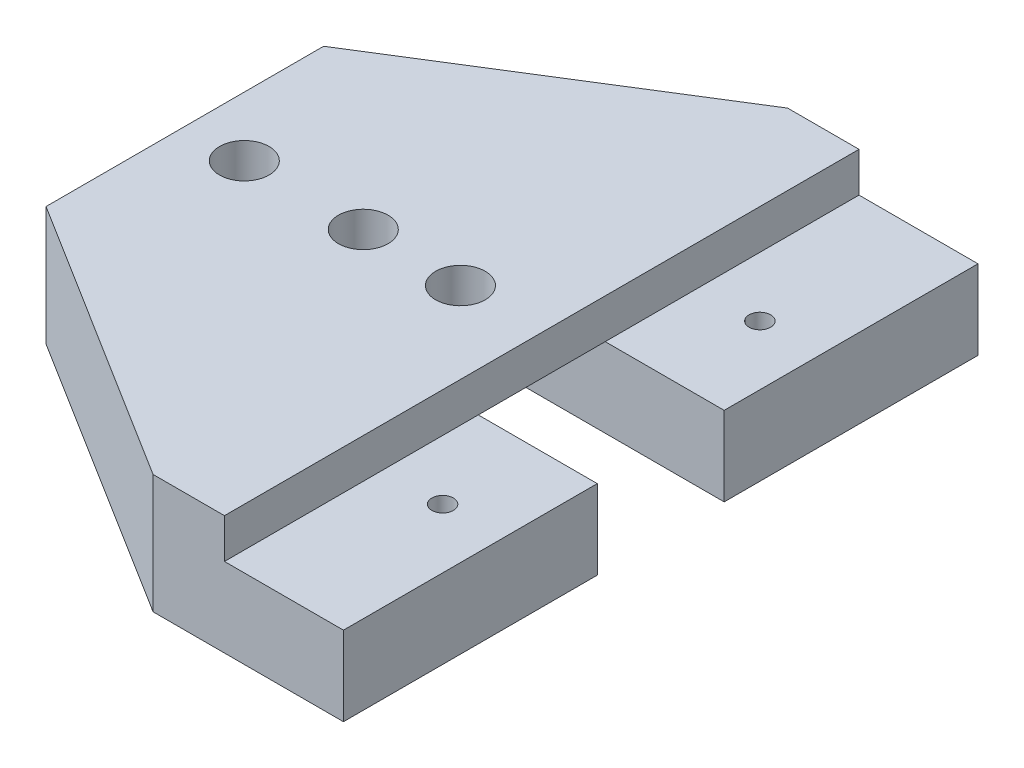
ISO-10303-21;
HEADER;
FILE_DESCRIPTION(('STEP AP214'),'2;1');
FILE_NAME('part.step','',(''),(''),'','','');
FILE_SCHEMA(('AUTOMOTIVE_DESIGN { 1 0 10303 214 1 1 1 1 }'));
ENDSEC;
DATA;
#1=APPLICATION_CONTEXT('core data for automotive mechanical design processes');
#2=APPLICATION_PROTOCOL_DEFINITION('international standard','automotive_design',2000,#1);
#3=PRODUCT_CONTEXT('',#1,'mechanical');
#4=PRODUCT('Part','Part','',(#3));
#5=PRODUCT_RELATED_PRODUCT_CATEGORY('part','',(#4));
#6=PRODUCT_DEFINITION_FORMATION('','',#4);
#7=PRODUCT_DEFINITION_CONTEXT('part definition',#1,'design');
#8=PRODUCT_DEFINITION('design','',#6,#7);
#9=PRODUCT_DEFINITION_SHAPE('','',#8);
#10=(LENGTH_UNIT() NAMED_UNIT(*) SI_UNIT(.MILLI.,.METRE.));
#11=(NAMED_UNIT(*) PLANE_ANGLE_UNIT() SI_UNIT($,.RADIAN.));
#12=(NAMED_UNIT(*) SI_UNIT($,.STERADIAN.) SOLID_ANGLE_UNIT());
#13=UNCERTAINTY_MEASURE_WITH_UNIT(LENGTH_MEASURE(1.E-05),#10,'distance_accuracy_value','');
#14=(GEOMETRIC_REPRESENTATION_CONTEXT(3) GLOBAL_UNCERTAINTY_ASSIGNED_CONTEXT((#13)) GLOBAL_UNIT_ASSIGNED_CONTEXT((#10,
#11,#12)) REPRESENTATION_CONTEXT('',''));
#15=CARTESIAN_POINT('',(0.,0.,0.));
#16=DIRECTION('',(0.,0.,1.));
#17=DIRECTION('',(1.,0.,0.));
#18=AXIS2_PLACEMENT_3D('',#15,#16,#17);
#19=CARTESIAN_POINT('',(-15.24,9.525,50.8));
#20=DIRECTION('',(0.,0.,-1.));
#21=DIRECTION('',(-1.,0.,0.));
#22=AXIS2_PLACEMENT_3D('',#19,#20,#21);
#23=PLANE('',#22);
#24=DIRECTION('',(0.,1.,0.));
#25=VECTOR('',#24,1.);
#26=CARTESIAN_POINT('',(-3.81,3.175,50.8));
#27=LINE('',#26,#25);
#28=CARTESIAN_POINT('',(-3.81,3.175,50.8));
#29=VERTEX_POINT('',#28);
#30=CARTESIAN_POINT('',(-3.81,9.525,50.8));
#31=VERTEX_POINT('',#30);
#32=EDGE_CURVE('E150',#29,#31,#27,.T.);
#33=ORIENTED_EDGE('',*,*,#32,.T.);
#34=DIRECTION('',(1.,0.,0.));
#35=VECTOR('',#34,1.);
#36=CARTESIAN_POINT('',(-15.24,9.525,50.8));
#37=LINE('',#36,#35);
#38=CARTESIAN_POINT('',(-15.24,9.525,50.8));
#39=VERTEX_POINT('',#38);
#40=EDGE_CURVE('E213',#39,#31,#37,.T.);
#41=ORIENTED_EDGE('',*,*,#40,.F.);
#42=DIRECTION('',(0.,-1.,0.));
#43=VECTOR('',#42,1.);
#44=CARTESIAN_POINT('',(-15.24,9.525,50.8));
#45=LINE('',#44,#43);
#46=CARTESIAN_POINT('',(-15.24,-9.525,50.8));
#47=VERTEX_POINT('',#46);
#48=EDGE_CURVE('E229',#39,#47,#45,.T.);
#49=ORIENTED_EDGE('',*,*,#48,.T.);
#50=DIRECTION('',(1.,0.,0.));
#51=VECTOR('',#50,1.);
#52=CARTESIAN_POINT('',(-15.24,-9.525,50.8));
#53=LINE('',#52,#51);
#54=CARTESIAN_POINT('',(15.24,-9.525,50.8));
#55=VERTEX_POINT('',#54);
#56=EDGE_CURVE('E203',#47,#55,#53,.T.);
#57=ORIENTED_EDGE('',*,*,#56,.T.);
#58=DIRECTION('',(0.,-1.,0.));
#59=VECTOR('',#58,1.);
#60=CARTESIAN_POINT('',(15.24,9.525,50.8));
#61=LINE('',#60,#59);
#62=CARTESIAN_POINT('',(15.24,3.175,50.8));
#63=VERTEX_POINT('',#62);
#64=EDGE_CURVE('E52',#63,#55,#61,.T.);
#65=ORIENTED_EDGE('',*,*,#64,.F.);
#66=DIRECTION('',(-1.,0.,0.));
#67=VECTOR('',#66,1.);
#68=CARTESIAN_POINT('',(15.24,3.175,50.8));
#69=LINE('',#68,#67);
#70=EDGE_CURVE('E140',#63,#29,#69,.T.);
#71=ORIENTED_EDGE('',*,*,#70,.T.);
#72=EDGE_LOOP('',(#33,#41,#49,#57,#65,#71));
#73=FACE_BOUND('',#72,.T.);
#74=ADVANCED_FACE('F43',(#73),#23,.F.);
#75=CARTESIAN_POINT('',(15.24,9.525,50.8));
#76=DIRECTION('',(-1.,0.,0.));
#77=DIRECTION('',(0.,0.,1.));
#78=AXIS2_PLACEMENT_3D('',#75,#76,#77);
#79=PLANE('',#78);
#80=DIRECTION('',(0.,-1.,0.));
#81=VECTOR('',#80,1.);
#82=CARTESIAN_POINT('',(15.24,9.525,-50.8));
#83=LINE('',#82,#81);
#84=CARTESIAN_POINT('',(15.24,3.175,-50.8));
#85=VERTEX_POINT('',#84);
#86=CARTESIAN_POINT('',(15.24,-9.525,-50.8));
#87=VERTEX_POINT('',#86);
#88=EDGE_CURVE('E265',#85,#87,#83,.T.);
#89=ORIENTED_EDGE('',*,*,#88,.F.);
#90=DIRECTION('',(0.,0.,-1.));
#91=VECTOR('',#90,1.);
#92=CARTESIAN_POINT('',(15.24,3.175,50.8));
#93=LINE('',#92,#91);
#94=CARTESIAN_POINT('',(15.24,3.175,-10.16));
#95=VERTEX_POINT('',#94);
#96=EDGE_CURVE('E176',#95,#85,#93,.T.);
#97=ORIENTED_EDGE('',*,*,#96,.F.);
#98=DIRECTION('',(0.,-1.,0.));
#99=VECTOR('',#98,1.);
#100=CARTESIAN_POINT('',(15.24,3.175,-10.16));
#101=LINE('',#100,#99);
#102=CARTESIAN_POINT('',(15.24,-9.525,-10.16));
#103=VERTEX_POINT('',#102);
#104=EDGE_CURVE('E207',#95,#103,#101,.T.);
#105=ORIENTED_EDGE('',*,*,#104,.T.);
#106=DIRECTION('',(0.,0.,-1.));
#107=VECTOR('',#106,1.);
#108=CARTESIAN_POINT('',(15.24,-9.525,50.8));
#109=LINE('',#108,#107);
#110=EDGE_CURVE('E232',#103,#87,#109,.T.);
#111=ORIENTED_EDGE('',*,*,#110,.T.);
#112=EDGE_LOOP('',(#89,#97,#105,#111));
#113=FACE_BOUND('',#112,.T.);
#114=ADVANCED_FACE('F322',(#113),#79,.F.);
#115=CARTESIAN_POINT('',(15.24,9.525,-50.8));
#116=DIRECTION('',(0.,0.,1.));
#117=DIRECTION('',(1.,0.,0.));
#118=AXIS2_PLACEMENT_3D('',#115,#116,#117);
#119=PLANE('',#118);
#120=DIRECTION('',(0.,1.,0.));
#121=VECTOR('',#120,1.);
#122=CARTESIAN_POINT('',(-3.81,3.175,-50.8));
#123=LINE('',#122,#121);
#124=CARTESIAN_POINT('',(-3.81,3.175,-50.8));
#125=VERTEX_POINT('',#124);
#126=CARTESIAN_POINT('',(-3.81,9.525,-50.8));
#127=VERTEX_POINT('',#126);
#128=EDGE_CURVE('E159',#125,#127,#123,.T.);
#129=ORIENTED_EDGE('',*,*,#128,.F.);
#130=DIRECTION('',(-1.,0.,0.));
#131=VECTOR('',#130,1.);
#132=CARTESIAN_POINT('',(15.24,3.175,-50.8));
#133=LINE('',#132,#131);
#134=EDGE_CURVE('E146',#85,#125,#133,.T.);
#135=ORIENTED_EDGE('',*,*,#134,.F.);
#136=ORIENTED_EDGE('',*,*,#88,.T.);
#137=DIRECTION('',(-1.,0.,0.));
#138=VECTOR('',#137,1.);
#139=CARTESIAN_POINT('',(15.24,-9.525,-50.8));
#140=LINE('',#139,#138);
#141=CARTESIAN_POINT('',(-15.24,-9.525,-50.8));
#142=VERTEX_POINT('',#141);
#143=EDGE_CURVE('E237',#87,#142,#140,.T.);
#144=ORIENTED_EDGE('',*,*,#143,.T.);
#145=DIRECTION('',(0.,-1.,0.));
#146=VECTOR('',#145,1.);
#147=CARTESIAN_POINT('',(-15.24,9.525,-50.8));
#148=LINE('',#147,#146);
#149=CARTESIAN_POINT('',(-15.24,9.525,-50.8));
#150=VERTEX_POINT('',#149);
#151=EDGE_CURVE('E261',#150,#142,#148,.T.);
#152=ORIENTED_EDGE('',*,*,#151,.F.);
#153=DIRECTION('',(-1.,0.,0.));
#154=VECTOR('',#153,1.);
#155=CARTESIAN_POINT('',(15.24,9.525,-50.8));
#156=LINE('',#155,#154);
#157=EDGE_CURVE('E216',#127,#150,#156,.T.);
#158=ORIENTED_EDGE('',*,*,#157,.F.);
#159=EDGE_LOOP('',(#129,#135,#136,#144,#152,#158));
#160=FACE_BOUND('',#159,.T.);
#161=ADVANCED_FACE('F326',(#160),#119,.F.);
#162=CARTESIAN_POINT('',(0.,9.525,0.));
#163=DIRECTION('',(0.,1.,0.));
#164=DIRECTION('',(0.,0.,1.));
#165=AXIS2_PLACEMENT_3D('',#162,#163,#164);
#166=PLANE('',#165);
#167=CARTESIAN_POINT('',(-51.435,9.525,0.));
#168=DIRECTION('',(0.,1.,0.));
#169=DIRECTION('',(0.,0.,1.));
#170=AXIS2_PLACEMENT_3D('',#167,#168,#169);
#171=CIRCLE('',#170,3.96875);
#172=CARTESIAN_POINT('',(-51.435,9.525,3.96875));
#173=VERTEX_POINT('',#172);
#174=EDGE_CURVE('E287',#173,#173,#171,.T.);
#175=ORIENTED_EDGE('',*,*,#174,.F.);
#176=EDGE_LOOP('',(#175));
#177=FACE_BOUND('',#176,.T.);
#178=CARTESIAN_POINT('',(-32.385,9.525,0.));
#179=DIRECTION('',(0.,1.,0.));
#180=DIRECTION('',(0.,0.,1.));
#181=AXIS2_PLACEMENT_3D('',#178,#179,#180);
#182=CIRCLE('',#181,3.96875);
#183=CARTESIAN_POINT('',(-32.385,9.525,3.96875));
#184=VERTEX_POINT('',#183);
#185=EDGE_CURVE('E275',#184,#184,#182,.T.);
#186=ORIENTED_EDGE('',*,*,#185,.F.);
#187=EDGE_LOOP('',(#186));
#188=FACE_BOUND('',#187,.T.);
#189=CARTESIAN_POINT('',(-16.8275,9.525,0.));
#190=DIRECTION('',(0.,1.,0.));
#191=DIRECTION('',(0.,0.,1.));
#192=AXIS2_PLACEMENT_3D('',#189,#190,#191);
#193=CIRCLE('',#192,3.96875);
#194=CARTESIAN_POINT('',(-16.8275,9.525,3.96875));
#195=VERTEX_POINT('',#194);
#196=EDGE_CURVE('E170',#195,#195,#193,.T.);
#197=ORIENTED_EDGE('',*,*,#196,.F.);
#198=EDGE_LOOP('',(#197));
#199=FACE_BOUND('',#198,.T.);
#200=ORIENTED_EDGE('',*,*,#40,.T.);
#201=DIRECTION('',(0.,0.,-1.));
#202=VECTOR('',#201,1.);
#203=CARTESIAN_POINT('',(-3.81,9.525,50.8));
#204=LINE('',#203,#202);
#205=EDGE_CURVE('E153',#31,#127,#204,.T.);
#206=ORIENTED_EDGE('',*,*,#205,.T.);
#207=ORIENTED_EDGE('',*,*,#157,.T.);
#208=DIRECTION('',(-0.847998304005088,0.,0.52999894000318));
#209=VECTOR('',#208,1.);
#210=CARTESIAN_POINT('',(-15.24,9.525,-50.8));
#211=LINE('',#210,#209);
#212=CARTESIAN_POINT('',(-60.96,9.525,-22.225));
#213=VERTEX_POINT('',#212);
#214=EDGE_CURVE('E220',#150,#213,#211,.T.);
#215=ORIENTED_EDGE('',*,*,#214,.T.);
#216=DIRECTION('',(0.,0.,1.));
#217=VECTOR('',#216,1.);
#218=CARTESIAN_POINT('',(-60.96,9.525,-22.225));
#219=LINE('',#218,#217);
#220=CARTESIAN_POINT('',(-60.96,9.525,22.225));
#221=VERTEX_POINT('',#220);
#222=EDGE_CURVE('E223',#213,#221,#219,.T.);
#223=ORIENTED_EDGE('',*,*,#222,.T.);
#224=DIRECTION('',(0.847998304005088,0.,0.52999894000318));
#225=VECTOR('',#224,1.);
#226=CARTESIAN_POINT('',(-60.96,9.525,22.225));
#227=LINE('',#226,#225);
#228=EDGE_CURVE('E226',#221,#39,#227,.T.);
#229=ORIENTED_EDGE('',*,*,#228,.T.);
#230=EDGE_LOOP('',(#200,#206,#207,#215,#223,#229));
#231=FACE_BOUND('',#230,.T.);
#232=ADVANCED_FACE('F332',(#177,#188,#199,#231),#166,.T.);
#233=CARTESIAN_POINT('',(0.,3.175,0.));
#234=DIRECTION('',(0.,1.,0.));
#235=DIRECTION('',(0.,0.,1.));
#236=AXIS2_PLACEMENT_3D('',#233,#234,#235);
#237=PLANE('',#236);
#238=CARTESIAN_POINT('',(-51.435,3.175,0.));
#239=DIRECTION('',(0.,1.,0.));
#240=DIRECTION('',(0.,0.,1.));
#241=AXIS2_PLACEMENT_3D('',#238,#239,#240);
#242=CIRCLE('',#241,3.96875);
#243=CARTESIAN_POINT('',(-51.435,3.175,3.96875));
#244=VERTEX_POINT('',#243);
#245=EDGE_CURVE('E282',#244,#244,#242,.T.);
#246=ORIENTED_EDGE('',*,*,#245,.T.);
#247=EDGE_LOOP('',(#246));
#248=FACE_BOUND('',#247,.T.);
#249=CARTESIAN_POINT('',(-32.385,3.175,0.));
#250=DIRECTION('',(0.,1.,0.));
#251=DIRECTION('',(0.,0.,1.));
#252=AXIS2_PLACEMENT_3D('',#249,#250,#251);
#253=CIRCLE('',#252,3.96875);
#254=CARTESIAN_POINT('',(-32.385,3.175,3.96875));
#255=VERTEX_POINT('',#254);
#256=EDGE_CURVE('E272',#255,#255,#253,.T.);
#257=ORIENTED_EDGE('',*,*,#256,.T.);
#258=EDGE_LOOP('',(#257));
#259=FACE_BOUND('',#258,.T.);
#260=CARTESIAN_POINT('',(-16.8275,3.175,0.));
#261=DIRECTION('',(0.,1.,0.));
#262=DIRECTION('',(0.,0.,1.));
#263=AXIS2_PLACEMENT_3D('',#260,#261,#262);
#264=CIRCLE('',#263,3.96875);
#265=CARTESIAN_POINT('',(-16.8275,3.175,3.96875));
#266=VERTEX_POINT('',#265);
#267=EDGE_CURVE('E167',#266,#266,#264,.T.);
#268=ORIENTED_EDGE('',*,*,#267,.T.);
#269=EDGE_LOOP('',(#268));
#270=FACE_BOUND('',#269,.T.);
#271=DIRECTION('',(0.,0.,-1.));
#272=VECTOR('',#271,1.);
#273=CARTESIAN_POINT('',(-3.81,3.175,0.));
#274=LINE('',#273,#272);
#275=CARTESIAN_POINT('',(-3.81000000000001,3.175,10.16));
#276=VERTEX_POINT('',#275);
#277=CARTESIAN_POINT('',(-3.81,3.175,-10.16));
#278=VERTEX_POINT('',#277);
#279=EDGE_CURVE('E11',#276,#278,#274,.T.);
#280=ORIENTED_EDGE('',*,*,#279,.F.);
#281=DIRECTION('',(-1.,0.,0.));
#282=VECTOR('',#281,1.);
#283=CARTESIAN_POINT('',(-60.96,3.175,10.16));
#284=LINE('',#283,#282);
#285=CARTESIAN_POINT('',(-60.96,3.175,10.16));
#286=VERTEX_POINT('',#285);
#287=EDGE_CURVE('E192',#276,#286,#284,.T.);
#288=ORIENTED_EDGE('',*,*,#287,.T.);
#289=DIRECTION('',(0.,0.,-1.));
#290=VECTOR('',#289,1.);
#291=CARTESIAN_POINT('',(-60.96,3.175,-10.16));
#292=LINE('',#291,#290);
#293=CARTESIAN_POINT('',(-60.96,3.175,-10.16));
#294=VERTEX_POINT('',#293);
#295=EDGE_CURVE('E182',#286,#294,#292,.T.);
#296=ORIENTED_EDGE('',*,*,#295,.T.);
#297=DIRECTION('',(1.,0.,0.));
#298=VECTOR('',#297,1.);
#299=CARTESIAN_POINT('',(-60.96,3.175,-10.16));
#300=LINE('',#299,#298);
#301=EDGE_CURVE('E188',#294,#278,#300,.T.);
#302=ORIENTED_EDGE('',*,*,#301,.T.);
#303=EDGE_LOOP('',(#280,#288,#296,#302));
#304=FACE_BOUND('',#303,.T.);
#305=ADVANCED_FACE('F347',(#248,#259,#270,#304),#237,.F.);
#306=CARTESIAN_POINT('',(0.,-9.525,0.));
#307=DIRECTION('',(0.,1.,0.));
#308=DIRECTION('',(0.,0.,1.));
#309=AXIS2_PLACEMENT_3D('',#306,#307,#308);
#310=PLANE('',#309);
#311=CARTESIAN_POINT('',(5.71500000000001,-9.525,25.4));
#312=DIRECTION('',(0.,-1.,0.));
#313=DIRECTION('',(0.,0.,-1.));
#314=AXIS2_PLACEMENT_3D('',#311,#312,#313);
#315=CIRCLE('',#314,1.7272);
#316=CARTESIAN_POINT('',(5.71500000000001,-9.525,23.6728));
#317=VERTEX_POINT('',#316);
#318=EDGE_CURVE('E301',#317,#317,#315,.T.);
#319=ORIENTED_EDGE('',*,*,#318,.F.);
#320=EDGE_LOOP('',(#319));
#321=FACE_BOUND('',#320,.T.);
#322=DIRECTION('',(0.,0.,1.));
#323=VECTOR('',#322,1.);
#324=CARTESIAN_POINT('',(-60.96,-9.525,-22.225));
#325=LINE('',#324,#323);
#326=CARTESIAN_POINT('',(-60.96,-9.525,10.16));
#327=VERTEX_POINT('',#326);
#328=CARTESIAN_POINT('',(-60.96,-9.525,22.225));
#329=VERTEX_POINT('',#328);
#330=EDGE_CURVE('E243',#327,#329,#325,.T.);
#331=ORIENTED_EDGE('',*,*,#330,.F.);
#332=DIRECTION('',(-1.,0.,0.));
#333=VECTOR('',#332,1.);
#334=CARTESIAN_POINT('',(-60.96,-9.525,10.16));
#335=LINE('',#334,#333);
#336=CARTESIAN_POINT('',(15.24,-9.525,10.16));
#337=VERTEX_POINT('',#336);
#338=EDGE_CURVE('E187',#337,#327,#335,.T.);
#339=ORIENTED_EDGE('',*,*,#338,.F.);
#340=EDGE_CURVE('E233',#55,#337,#109,.T.);
#341=ORIENTED_EDGE('',*,*,#340,.F.);
#342=ORIENTED_EDGE('',*,*,#56,.F.);
#343=DIRECTION('',(0.847998304005088,0.,0.52999894000318));
#344=VECTOR('',#343,1.);
#345=CARTESIAN_POINT('',(-60.96,-9.525,22.225));
#346=LINE('',#345,#344);
#347=EDGE_CURVE('E217',#329,#47,#346,.T.);
#348=ORIENTED_EDGE('',*,*,#347,.F.);
#349=EDGE_LOOP('',(#331,#339,#341,#342,#348));
#350=FACE_BOUND('',#349,.T.);
#351=ADVANCED_FACE('F338',(#321,#350),#310,.F.);
#352=DIRECTION('',(0.,-1.,0.));
#353=VECTOR('',#352,1.);
#354=CARTESIAN_POINT('',(15.24,3.175,10.16));
#355=LINE('',#354,#353);
#356=CARTESIAN_POINT('',(15.24,3.175,10.16));
#357=VERTEX_POINT('',#356);
#358=EDGE_CURVE('E204',#357,#337,#355,.T.);
#359=ORIENTED_EDGE('',*,*,#358,.F.);
#360=EDGE_CURVE('E177',#63,#357,#93,.T.);
#361=ORIENTED_EDGE('',*,*,#360,.F.);
#362=ORIENTED_EDGE('',*,*,#64,.T.);
#363=ORIENTED_EDGE('',*,*,#340,.T.);
#364=EDGE_LOOP('',(#359,#361,#362,#363));
#365=FACE_BOUND('',#364,.T.);
#366=ADVANCED_FACE('F328',(#365),#79,.F.);
#367=CARTESIAN_POINT('',(-15.24,9.525,-50.8));
#368=DIRECTION('',(0.52999894000318,0.,0.847998304005088));
#369=DIRECTION('',(0.847998304005088,0.,-0.52999894000318));
#370=AXIS2_PLACEMENT_3D('',#367,#368,#369);
#371=PLANE('',#370);
#372=DIRECTION('',(-0.847998304005088,0.,0.52999894000318));
#373=VECTOR('',#372,1.);
#374=CARTESIAN_POINT('',(-15.24,-9.525,-50.8));
#375=LINE('',#374,#373);
#376=CARTESIAN_POINT('',(-60.96,-9.525,-22.225));
#377=VERTEX_POINT('',#376);
#378=EDGE_CURVE('E240',#142,#377,#375,.T.);
#379=ORIENTED_EDGE('',*,*,#378,.T.);
#380=DIRECTION('',(0.,-1.,0.));
#381=VECTOR('',#380,1.);
#382=CARTESIAN_POINT('',(-60.96,9.525,-22.225));
#383=LINE('',#382,#381);
#384=EDGE_CURVE('E257',#213,#377,#383,.T.);
#385=ORIENTED_EDGE('',*,*,#384,.F.);
#386=ORIENTED_EDGE('',*,*,#214,.F.);
#387=ORIENTED_EDGE('',*,*,#151,.T.);
#388=EDGE_LOOP('',(#379,#385,#386,#387));
#389=FACE_BOUND('',#388,.T.);
#390=ADVANCED_FACE('F337',(#389),#371,.F.);
#391=CARTESIAN_POINT('',(-60.96,9.525,-22.225));
#392=DIRECTION('',(1.,0.,0.));
#393=DIRECTION('',(0.,0.,-1.));
#394=AXIS2_PLACEMENT_3D('',#391,#392,#393);
#395=PLANE('',#394);
#396=ORIENTED_EDGE('',*,*,#295,.F.);
#397=DIRECTION('',(0.,-1.,0.));
#398=VECTOR('',#397,1.);
#399=CARTESIAN_POINT('',(-60.96,3.175,10.16));
#400=LINE('',#399,#398);
#401=EDGE_CURVE('E199',#286,#327,#400,.T.);
#402=ORIENTED_EDGE('',*,*,#401,.T.);
#403=ORIENTED_EDGE('',*,*,#330,.T.);
#404=DIRECTION('',(0.,-1.,0.));
#405=VECTOR('',#404,1.);
#406=CARTESIAN_POINT('',(-60.96,9.525,22.225));
#407=LINE('',#406,#405);
#408=EDGE_CURVE('E253',#221,#329,#407,.T.);
#409=ORIENTED_EDGE('',*,*,#408,.F.);
#410=ORIENTED_EDGE('',*,*,#222,.F.);
#411=ORIENTED_EDGE('',*,*,#384,.T.);
#412=CARTESIAN_POINT('',(-60.96,-9.525,-10.16));
#413=VERTEX_POINT('',#412);
#414=EDGE_CURVE('E244',#377,#413,#325,.T.);
#415=ORIENTED_EDGE('',*,*,#414,.T.);
#416=DIRECTION('',(0.,-1.,0.));
#417=VECTOR('',#416,1.);
#418=CARTESIAN_POINT('',(-60.96,3.175,-10.16));
#419=LINE('',#418,#417);
#420=EDGE_CURVE('E67',#294,#413,#419,.T.);
#421=ORIENTED_EDGE('',*,*,#420,.F.);
#422=EDGE_LOOP('',(#396,#402,#403,#409,#410,#411,#415,#421));
#423=FACE_BOUND('',#422,.T.);
#424=ADVANCED_FACE('F344',(#423),#395,.F.);
#425=CARTESIAN_POINT('',(-60.96,9.525,22.225));
#426=DIRECTION('',(0.52999894000318,0.,-0.847998304005088));
#427=DIRECTION('',(-0.847998304005088,0.,-0.52999894000318));
#428=AXIS2_PLACEMENT_3D('',#425,#426,#427);
#429=PLANE('',#428);
#430=ORIENTED_EDGE('',*,*,#347,.T.);
#431=ORIENTED_EDGE('',*,*,#48,.F.);
#432=ORIENTED_EDGE('',*,*,#228,.F.);
#433=ORIENTED_EDGE('',*,*,#408,.T.);
#434=EDGE_LOOP('',(#430,#431,#432,#433));
#435=FACE_BOUND('',#434,.T.);
#436=ADVANCED_FACE('F391',(#435),#429,.F.);
#437=CARTESIAN_POINT('',(5.71500000000001,-9.525,-25.4));
#438=DIRECTION('',(0.,-1.,0.));
#439=DIRECTION('',(0.,0.,-1.));
#440=AXIS2_PLACEMENT_3D('',#437,#438,#439);
#441=CIRCLE('',#440,1.7272);
#442=CARTESIAN_POINT('',(5.71500000000001,-9.525,-27.1272));
#443=VERTEX_POINT('',#442);
#444=EDGE_CURVE('E297',#443,#443,#441,.T.);
#445=ORIENTED_EDGE('',*,*,#444,.F.);
#446=EDGE_LOOP('',(#445));
#447=FACE_BOUND('',#446,.T.);
#448=ORIENTED_EDGE('',*,*,#110,.F.);
#449=DIRECTION('',(1.,0.,0.));
#450=VECTOR('',#449,1.);
#451=CARTESIAN_POINT('',(-60.96,-9.525,-10.16));
#452=LINE('',#451,#450);
#453=EDGE_CURVE('E158',#413,#103,#452,.T.);
#454=ORIENTED_EDGE('',*,*,#453,.F.);
#455=ORIENTED_EDGE('',*,*,#414,.F.);
#456=ORIENTED_EDGE('',*,*,#378,.F.);
#457=ORIENTED_EDGE('',*,*,#143,.F.);
#458=EDGE_LOOP('',(#448,#454,#455,#456,#457));
#459=FACE_BOUND('',#458,.T.);
#460=ADVANCED_FACE('F350',(#447,#459),#310,.F.);
#461=CARTESIAN_POINT('',(-60.96,3.175,10.16));
#462=DIRECTION('',(0.,0.,1.));
#463=DIRECTION('',(1.,0.,0.));
#464=AXIS2_PLACEMENT_3D('',#461,#462,#463);
#465=PLANE('',#464);
#466=ORIENTED_EDGE('',*,*,#338,.T.);
#467=ORIENTED_EDGE('',*,*,#401,.F.);
#468=ORIENTED_EDGE('',*,*,#287,.F.);
#469=EDGE_CURVE('E143',#357,#276,#284,.T.);
#470=ORIENTED_EDGE('',*,*,#469,.F.);
#471=ORIENTED_EDGE('',*,*,#358,.T.);
#472=EDGE_LOOP('',(#466,#467,#468,#470,#471));
#473=FACE_BOUND('',#472,.T.);
#474=ADVANCED_FACE('F355',(#473),#465,.F.);
#475=CARTESIAN_POINT('',(-60.96,3.175,-10.16));
#476=DIRECTION('',(0.,0.,-1.));
#477=DIRECTION('',(-1.,0.,0.));
#478=AXIS2_PLACEMENT_3D('',#475,#476,#477);
#479=PLANE('',#478);
#480=ORIENTED_EDGE('',*,*,#453,.T.);
#481=ORIENTED_EDGE('',*,*,#104,.F.);
#482=EDGE_CURVE('E186',#278,#95,#300,.T.);
#483=ORIENTED_EDGE('',*,*,#482,.F.);
#484=ORIENTED_EDGE('',*,*,#301,.F.);
#485=ORIENTED_EDGE('',*,*,#420,.T.);
#486=EDGE_LOOP('',(#480,#481,#483,#484,#485));
#487=FACE_BOUND('',#486,.T.);
#488=ADVANCED_FACE('F393',(#487),#479,.F.);
#489=CARTESIAN_POINT('',(0.,3.175,0.));
#490=DIRECTION('',(0.,-1.,0.));
#491=DIRECTION('',(0.,0.,-1.));
#492=AXIS2_PLACEMENT_3D('',#489,#490,#491);
#493=PLANE('',#492);
#494=CARTESIAN_POINT('',(5.71500000000001,3.175,25.4));
#495=DIRECTION('',(0.,-1.,0.));
#496=DIRECTION('',(0.,0.,-1.));
#497=AXIS2_PLACEMENT_3D('',#494,#495,#496);
#498=CIRCLE('',#497,1.7272);
#499=CARTESIAN_POINT('',(5.71500000000001,3.175,23.6728));
#500=VERTEX_POINT('',#499);
#501=EDGE_CURVE('E46',#500,#500,#498,.T.);
#502=ORIENTED_EDGE('',*,*,#501,.T.);
#503=EDGE_LOOP('',(#502));
#504=FACE_BOUND('',#503,.T.);
#505=DIRECTION('',(0.,0.,-1.));
#506=VECTOR('',#505,1.);
#507=CARTESIAN_POINT('',(-3.81,3.175,50.8));
#508=LINE('',#507,#506);
#509=EDGE_CURVE('E59',#29,#276,#508,.T.);
#510=ORIENTED_EDGE('',*,*,#509,.F.);
#511=ORIENTED_EDGE('',*,*,#70,.F.);
#512=ORIENTED_EDGE('',*,*,#360,.T.);
#513=ORIENTED_EDGE('',*,*,#469,.T.);
#514=EDGE_LOOP('',(#510,#511,#512,#513));
#515=FACE_BOUND('',#514,.T.);
#516=ADVANCED_FACE('F138',(#504,#515),#493,.F.);
#517=CARTESIAN_POINT('',(5.71500000000001,3.175,-25.4));
#518=DIRECTION('',(0.,-1.,0.));
#519=DIRECTION('',(0.,0.,-1.));
#520=AXIS2_PLACEMENT_3D('',#517,#518,#519);
#521=CIRCLE('',#520,1.7272);
#522=CARTESIAN_POINT('',(5.71500000000001,3.175,-27.1272));
#523=VERTEX_POINT('',#522);
#524=EDGE_CURVE('E293',#523,#523,#521,.T.);
#525=ORIENTED_EDGE('',*,*,#524,.T.);
#526=EDGE_LOOP('',(#525));
#527=FACE_BOUND('',#526,.T.);
#528=ORIENTED_EDGE('',*,*,#96,.T.);
#529=ORIENTED_EDGE('',*,*,#134,.T.);
#530=EDGE_CURVE('E147',#278,#125,#508,.T.);
#531=ORIENTED_EDGE('',*,*,#530,.F.);
#532=ORIENTED_EDGE('',*,*,#482,.T.);
#533=EDGE_LOOP('',(#528,#529,#531,#532));
#534=FACE_BOUND('',#533,.T.);
#535=ADVANCED_FACE('F373',(#527,#534),#493,.F.);
#536=CARTESIAN_POINT('',(-3.81,3.175,50.8));
#537=DIRECTION('',(1.,0.,0.));
#538=DIRECTION('',(0.,0.,-1.));
#539=AXIS2_PLACEMENT_3D('',#536,#537,#538);
#540=PLANE('',#539);
#541=ORIENTED_EDGE('',*,*,#205,.F.);
#542=ORIENTED_EDGE('',*,*,#32,.F.);
#543=ORIENTED_EDGE('',*,*,#509,.T.);
#544=ORIENTED_EDGE('',*,*,#279,.T.);
#545=ORIENTED_EDGE('',*,*,#530,.T.);
#546=ORIENTED_EDGE('',*,*,#128,.T.);
#547=EDGE_LOOP('',(#541,#542,#543,#544,#545,#546));
#548=FACE_BOUND('',#547,.T.);
#549=ADVANCED_FACE('F151',(#548),#540,.T.);
#550=CARTESIAN_POINT('',(-16.8275,9.525,0.));
#551=DIRECTION('',(0.,1.,0.));
#552=DIRECTION('',(0.,0.,1.));
#553=AXIS2_PLACEMENT_3D('',#550,#551,#552);
#554=CYLINDRICAL_SURFACE('',#553,3.96875);
#555=ORIENTED_EDGE('',*,*,#196,.T.);
#556=EDGE_LOOP('',(#555));
#557=FACE_BOUND('',#556,.T.);
#558=ORIENTED_EDGE('',*,*,#267,.F.);
#559=EDGE_LOOP('',(#558));
#560=FACE_BOUND('',#559,.T.);
#561=ADVANCED_FACE('F454',(#557,#560),#554,.F.);
#562=CARTESIAN_POINT('',(-32.385,9.525,0.));
#563=DIRECTION('',(0.,1.,0.));
#564=DIRECTION('',(0.,0.,1.));
#565=AXIS2_PLACEMENT_3D('',#562,#563,#564);
#566=CYLINDRICAL_SURFACE('',#565,3.96875);
#567=ORIENTED_EDGE('',*,*,#185,.T.);
#568=EDGE_LOOP('',(#567));
#569=FACE_BOUND('',#568,.T.);
#570=ORIENTED_EDGE('',*,*,#256,.F.);
#571=EDGE_LOOP('',(#570));
#572=FACE_BOUND('',#571,.T.);
#573=ADVANCED_FACE('F461',(#569,#572),#566,.F.);
#574=CARTESIAN_POINT('',(-51.435,9.525,0.));
#575=DIRECTION('',(0.,1.,0.));
#576=DIRECTION('',(0.,0.,1.));
#577=AXIS2_PLACEMENT_3D('',#574,#575,#576);
#578=CYLINDRICAL_SURFACE('',#577,3.96875);
#579=ORIENTED_EDGE('',*,*,#174,.T.);
#580=EDGE_LOOP('',(#579));
#581=FACE_BOUND('',#580,.T.);
#582=ORIENTED_EDGE('',*,*,#245,.F.);
#583=EDGE_LOOP('',(#582));
#584=FACE_BOUND('',#583,.T.);
#585=ADVANCED_FACE('F318',(#581,#584),#578,.F.);
#586=CARTESIAN_POINT('',(5.71500000000001,-9.525,-25.4));
#587=DIRECTION('',(0.,-1.,0.));
#588=DIRECTION('',(0.,0.,-1.));
#589=AXIS2_PLACEMENT_3D('',#586,#587,#588);
#590=CYLINDRICAL_SURFACE('',#589,1.7272);
#591=ORIENTED_EDGE('',*,*,#444,.T.);
#592=EDGE_LOOP('',(#591));
#593=FACE_BOUND('',#592,.T.);
#594=ORIENTED_EDGE('',*,*,#524,.F.);
#595=EDGE_LOOP('',(#594));
#596=FACE_BOUND('',#595,.T.);
#597=ADVANCED_FACE('F313',(#593,#596),#590,.F.);
#598=CARTESIAN_POINT('',(5.71500000000001,-9.525,25.4));
#599=DIRECTION('',(0.,-1.,0.));
#600=DIRECTION('',(0.,0.,-1.));
#601=AXIS2_PLACEMENT_3D('',#598,#599,#600);
#602=CYLINDRICAL_SURFACE('',#601,1.7272);
#603=ORIENTED_EDGE('',*,*,#318,.T.);
#604=EDGE_LOOP('',(#603));
#605=FACE_BOUND('',#604,.T.);
#606=ORIENTED_EDGE('',*,*,#501,.F.);
#607=EDGE_LOOP('',(#606));
#608=FACE_BOUND('',#607,.T.);
#609=ADVANCED_FACE('F311',(#605,#608),#602,.F.);
#610=CLOSED_SHELL('',(#74,#114,#161,#232,#305,#351,#366,#390,#424,#436,#460,#474,#488,#516,#535,
#549,#561,#573,#585,#597,#609));
#611=MANIFOLD_SOLID_BREP('B2',#610);
#612=ADVANCED_BREP_SHAPE_REPRESENTATION('',(#18,#611),#14);
#613=SHAPE_DEFINITION_REPRESENTATION(#9,#612);
ENDSEC;
END-ISO-10303-21;
